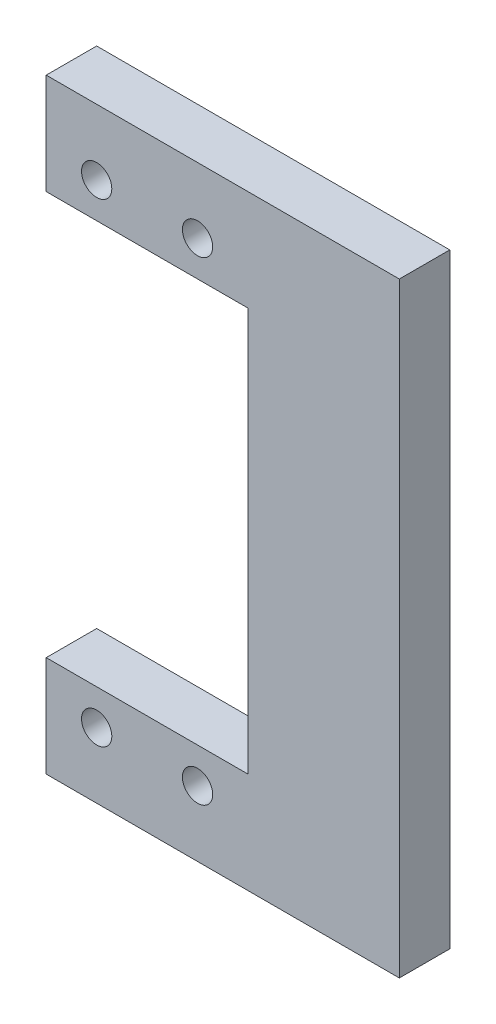
ISO-10303-21;
HEADER;
FILE_DESCRIPTION(('STEP AP214'),'2;1');
FILE_NAME('part.step','',(''),(''),'','','');
FILE_SCHEMA(('AUTOMOTIVE_DESIGN { 1 0 10303 214 1 1 1 1 }'));
ENDSEC;
DATA;
#1=APPLICATION_CONTEXT('core data for automotive mechanical design processes');
#2=APPLICATION_PROTOCOL_DEFINITION('international standard','automotive_design',2000,#1);
#3=PRODUCT_CONTEXT('',#1,'mechanical');
#4=PRODUCT('Part','Part','',(#3));
#5=PRODUCT_RELATED_PRODUCT_CATEGORY('part','',(#4));
#6=PRODUCT_DEFINITION_FORMATION('','',#4);
#7=PRODUCT_DEFINITION_CONTEXT('part definition',#1,'design');
#8=PRODUCT_DEFINITION('design','',#6,#7);
#9=PRODUCT_DEFINITION_SHAPE('','',#8);
#10=(LENGTH_UNIT() NAMED_UNIT(*) SI_UNIT(.MILLI.,.METRE.));
#11=(NAMED_UNIT(*) PLANE_ANGLE_UNIT() SI_UNIT($,.RADIAN.));
#12=(NAMED_UNIT(*) SI_UNIT($,.STERADIAN.) SOLID_ANGLE_UNIT());
#13=UNCERTAINTY_MEASURE_WITH_UNIT(LENGTH_MEASURE(1.E-05),#10,'distance_accuracy_value','');
#14=(GEOMETRIC_REPRESENTATION_CONTEXT(3) GLOBAL_UNCERTAINTY_ASSIGNED_CONTEXT((#13)) GLOBAL_UNIT_ASSIGNED_CONTEXT((#10,
#11,#12)) REPRESENTATION_CONTEXT('',''));
#15=CARTESIAN_POINT('',(0.,0.,0.));
#16=DIRECTION('',(0.,0.,1.));
#17=DIRECTION('',(1.,0.,0.));
#18=AXIS2_PLACEMENT_3D('',#15,#16,#17);
#19=CARTESIAN_POINT('',(0.,0.,5.));
#20=DIRECTION('',(0.,0.,-1.));
#21=DIRECTION('',(-1.,0.,0.));
#22=AXIS2_PLACEMENT_3D('',#19,#20,#21);
#23=PLANE('',#22);
#24=CARTESIAN_POINT('',(15.,6.5,5.));
#25=DIRECTION('',(0.,0.,1.));
#26=DIRECTION('',(1.,0.,0.));
#27=AXIS2_PLACEMENT_3D('',#24,#25,#26);
#28=CIRCLE('',#27,1.5);
#29=CARTESIAN_POINT('',(16.5,6.5,5.));
#30=VERTEX_POINT('',#29);
#31=EDGE_CURVE('E187',#30,#30,#28,.T.);
#32=ORIENTED_EDGE('',*,*,#31,.F.);
#33=EDGE_LOOP('',(#32));
#34=FACE_BOUND('',#33,.T.);
#35=CARTESIAN_POINT('',(5.,53.5,5.));
#36=DIRECTION('',(0.,0.,1.));
#37=DIRECTION('',(1.,0.,0.));
#38=AXIS2_PLACEMENT_3D('',#35,#36,#37);
#39=CIRCLE('',#38,1.5);
#40=CARTESIAN_POINT('',(6.5,53.5,5.));
#41=VERTEX_POINT('',#40);
#42=EDGE_CURVE('E133',#41,#41,#39,.T.);
#43=ORIENTED_EDGE('',*,*,#42,.F.);
#44=EDGE_LOOP('',(#43));
#45=FACE_BOUND('',#44,.T.);
#46=DIRECTION('',(0.,-1.,0.));
#47=VECTOR('',#46,1.);
#48=CARTESIAN_POINT('',(0.,0.,5.));
#49=LINE('',#48,#47);
#50=CARTESIAN_POINT('',(0.,10.,5.));
#51=VERTEX_POINT('',#50);
#52=CARTESIAN_POINT('',(0.,0.,5.));
#53=VERTEX_POINT('',#52);
#54=EDGE_CURVE('E144',#51,#53,#49,.T.);
#55=ORIENTED_EDGE('',*,*,#54,.T.);
#56=DIRECTION('',(1.,0.,0.));
#57=VECTOR('',#56,1.);
#58=CARTESIAN_POINT('',(0.,0.,5.));
#59=LINE('',#58,#57);
#60=CARTESIAN_POINT('',(35.,0.,5.));
#61=VERTEX_POINT('',#60);
#62=EDGE_CURVE('E92',#53,#61,#59,.T.);
#63=ORIENTED_EDGE('',*,*,#62,.T.);
#64=DIRECTION('',(0.,1.,0.));
#65=VECTOR('',#64,1.);
#66=CARTESIAN_POINT('',(35.,0.,5.));
#67=LINE('',#66,#65);
#68=CARTESIAN_POINT('',(35.,60.,5.));
#69=VERTEX_POINT('',#68);
#70=EDGE_CURVE('E159',#61,#69,#67,.T.);
#71=ORIENTED_EDGE('',*,*,#70,.T.);
#72=DIRECTION('',(-1.,0.,0.));
#73=VECTOR('',#72,1.);
#74=CARTESIAN_POINT('',(0.,60.,5.));
#75=LINE('',#74,#73);
#76=CARTESIAN_POINT('',(0.,60.,5.));
#77=VERTEX_POINT('',#76);
#78=EDGE_CURVE('E172',#69,#77,#75,.T.);
#79=ORIENTED_EDGE('',*,*,#78,.T.);
#80=DIRECTION('',(0.,-1.,0.));
#81=VECTOR('',#80,1.);
#82=CARTESIAN_POINT('',(0.,50.,5.));
#83=LINE('',#82,#81);
#84=CARTESIAN_POINT('',(0.,50.,5.));
#85=VERTEX_POINT('',#84);
#86=EDGE_CURVE('E111',#77,#85,#83,.T.);
#87=ORIENTED_EDGE('',*,*,#86,.T.);
#88=DIRECTION('',(1.,0.,0.));
#89=VECTOR('',#88,1.);
#90=CARTESIAN_POINT('',(0.,50.,5.));
#91=LINE('',#90,#89);
#92=CARTESIAN_POINT('',(20.,50.,5.));
#93=VERTEX_POINT('',#92);
#94=EDGE_CURVE('E105',#85,#93,#91,.T.);
#95=ORIENTED_EDGE('',*,*,#94,.T.);
#96=DIRECTION('',(0.,-1.,0.));
#97=VECTOR('',#96,1.);
#98=CARTESIAN_POINT('',(20.,10.,5.));
#99=LINE('',#98,#97);
#100=CARTESIAN_POINT('',(20.,10.,5.));
#101=VERTEX_POINT('',#100);
#102=EDGE_CURVE('E109',#93,#101,#99,.T.);
#103=ORIENTED_EDGE('',*,*,#102,.T.);
#104=DIRECTION('',(-1.,0.,0.));
#105=VECTOR('',#104,1.);
#106=CARTESIAN_POINT('',(0.,10.,5.));
#107=LINE('',#106,#105);
#108=EDGE_CURVE('E49',#101,#51,#107,.T.);
#109=ORIENTED_EDGE('',*,*,#108,.T.);
#110=EDGE_LOOP('',(#55,#63,#71,#79,#87,#95,#103,#109));
#111=FACE_BOUND('',#110,.T.);
#112=CARTESIAN_POINT('',(15.,53.5,5.));
#113=DIRECTION('',(0.,0.,1.));
#114=DIRECTION('',(-1.,0.,0.));
#115=AXIS2_PLACEMENT_3D('',#112,#113,#114);
#116=CIRCLE('',#115,1.5);
#117=CARTESIAN_POINT('',(13.5,53.5,5.));
#118=VERTEX_POINT('',#117);
#119=EDGE_CURVE('E181',#118,#118,#116,.T.);
#120=ORIENTED_EDGE('',*,*,#119,.F.);
#121=EDGE_LOOP('',(#120));
#122=FACE_BOUND('',#121,.T.);
#123=CARTESIAN_POINT('',(5.,6.5,5.));
#124=DIRECTION('',(0.,0.,1.));
#125=DIRECTION('',(-1.,0.,0.));
#126=AXIS2_PLACEMENT_3D('',#123,#124,#125);
#127=CIRCLE('',#126,1.5);
#128=CARTESIAN_POINT('',(3.5,6.5,5.));
#129=VERTEX_POINT('',#128);
#130=EDGE_CURVE('E193',#129,#129,#127,.T.);
#131=ORIENTED_EDGE('',*,*,#130,.F.);
#132=EDGE_LOOP('',(#131));
#133=FACE_BOUND('',#132,.T.);
#134=ADVANCED_FACE('F32',(#34,#45,#111,#122,#133),#23,.F.);
#135=CARTESIAN_POINT('',(0.,0.,0.));
#136=DIRECTION('',(0.,0.,-1.));
#137=DIRECTION('',(-1.,0.,0.));
#138=AXIS2_PLACEMENT_3D('',#135,#136,#137);
#139=PLANE('',#138);
#140=CARTESIAN_POINT('',(15.,6.5,0.));
#141=DIRECTION('',(0.,0.,1.));
#142=DIRECTION('',(1.,0.,0.));
#143=AXIS2_PLACEMENT_3D('',#140,#141,#142);
#144=CIRCLE('',#143,1.5);
#145=CARTESIAN_POINT('',(16.5,6.5,0.));
#146=VERTEX_POINT('',#145);
#147=EDGE_CURVE('E190',#146,#146,#144,.T.);
#148=ORIENTED_EDGE('',*,*,#147,.T.);
#149=EDGE_LOOP('',(#148));
#150=FACE_BOUND('',#149,.T.);
#151=CARTESIAN_POINT('',(5.,53.5,0.));
#152=DIRECTION('',(0.,0.,1.));
#153=DIRECTION('',(1.,0.,0.));
#154=AXIS2_PLACEMENT_3D('',#151,#152,#153);
#155=CIRCLE('',#154,1.5);
#156=CARTESIAN_POINT('',(6.5,53.5,0.));
#157=VERTEX_POINT('',#156);
#158=EDGE_CURVE('E178',#157,#157,#155,.T.);
#159=ORIENTED_EDGE('',*,*,#158,.T.);
#160=EDGE_LOOP('',(#159));
#161=FACE_BOUND('',#160,.T.);
#162=DIRECTION('',(0.,-1.,0.));
#163=VECTOR('',#162,1.);
#164=CARTESIAN_POINT('',(0.,0.,0.));
#165=LINE('',#164,#163);
#166=CARTESIAN_POINT('',(0.,10.,0.));
#167=VERTEX_POINT('',#166);
#168=CARTESIAN_POINT('',(0.,0.,0.));
#169=VERTEX_POINT('',#168);
#170=EDGE_CURVE('E129',#167,#169,#165,.T.);
#171=ORIENTED_EDGE('',*,*,#170,.F.);
#172=DIRECTION('',(-1.,0.,0.));
#173=VECTOR('',#172,1.);
#174=CARTESIAN_POINT('',(0.,10.,0.));
#175=LINE('',#174,#173);
#176=CARTESIAN_POINT('',(20.,10.,0.));
#177=VERTEX_POINT('',#176);
#178=EDGE_CURVE('E84',#177,#167,#175,.T.);
#179=ORIENTED_EDGE('',*,*,#178,.F.);
#180=DIRECTION('',(0.,-1.,0.));
#181=VECTOR('',#180,1.);
#182=CARTESIAN_POINT('',(20.,10.,0.));
#183=LINE('',#182,#181);
#184=CARTESIAN_POINT('',(20.,50.,0.));
#185=VERTEX_POINT('',#184);
#186=EDGE_CURVE('E78',#185,#177,#183,.T.);
#187=ORIENTED_EDGE('',*,*,#186,.F.);
#188=DIRECTION('',(1.,0.,0.));
#189=VECTOR('',#188,1.);
#190=CARTESIAN_POINT('',(0.,50.,0.));
#191=LINE('',#190,#189);
#192=CARTESIAN_POINT('',(0.,50.,0.));
#193=VERTEX_POINT('',#192);
#194=EDGE_CURVE('E119',#193,#185,#191,.T.);
#195=ORIENTED_EDGE('',*,*,#194,.F.);
#196=DIRECTION('',(0.,-1.,0.));
#197=VECTOR('',#196,1.);
#198=CARTESIAN_POINT('',(0.,50.,0.));
#199=LINE('',#198,#197);
#200=CARTESIAN_POINT('',(0.,60.,0.));
#201=VERTEX_POINT('',#200);
#202=EDGE_CURVE('E139',#201,#193,#199,.T.);
#203=ORIENTED_EDGE('',*,*,#202,.F.);
#204=DIRECTION('',(-1.,0.,0.));
#205=VECTOR('',#204,1.);
#206=CARTESIAN_POINT('',(0.,60.,0.));
#207=LINE('',#206,#205);
#208=CARTESIAN_POINT('',(35.,60.,0.));
#209=VERTEX_POINT('',#208);
#210=EDGE_CURVE('E137',#209,#201,#207,.T.);
#211=ORIENTED_EDGE('',*,*,#210,.F.);
#212=DIRECTION('',(0.,1.,0.));
#213=VECTOR('',#212,1.);
#214=CARTESIAN_POINT('',(35.,0.,0.));
#215=LINE('',#214,#213);
#216=CARTESIAN_POINT('',(35.,0.,0.));
#217=VERTEX_POINT('',#216);
#218=EDGE_CURVE('E135',#217,#209,#215,.T.);
#219=ORIENTED_EDGE('',*,*,#218,.F.);
#220=DIRECTION('',(1.,0.,0.));
#221=VECTOR('',#220,1.);
#222=CARTESIAN_POINT('',(0.,0.,0.));
#223=LINE('',#222,#221);
#224=EDGE_CURVE('E132',#169,#217,#223,.T.);
#225=ORIENTED_EDGE('',*,*,#224,.F.);
#226=EDGE_LOOP('',(#171,#179,#187,#195,#203,#211,#219,#225));
#227=FACE_BOUND('',#226,.T.);
#228=CARTESIAN_POINT('',(15.,53.5,0.));
#229=DIRECTION('',(0.,0.,1.));
#230=DIRECTION('',(-1.,0.,0.));
#231=AXIS2_PLACEMENT_3D('',#228,#229,#230);
#232=CIRCLE('',#231,1.5);
#233=CARTESIAN_POINT('',(13.5,53.5,0.));
#234=VERTEX_POINT('',#233);
#235=EDGE_CURVE('E184',#234,#234,#232,.T.);
#236=ORIENTED_EDGE('',*,*,#235,.T.);
#237=EDGE_LOOP('',(#236));
#238=FACE_BOUND('',#237,.T.);
#239=CARTESIAN_POINT('',(5.,6.5,0.));
#240=DIRECTION('',(0.,0.,1.));
#241=DIRECTION('',(-1.,0.,0.));
#242=AXIS2_PLACEMENT_3D('',#239,#240,#241);
#243=CIRCLE('',#242,1.5);
#244=CARTESIAN_POINT('',(3.5,6.5,0.));
#245=VERTEX_POINT('',#244);
#246=EDGE_CURVE('E196',#245,#245,#243,.T.);
#247=ORIENTED_EDGE('',*,*,#246,.T.);
#248=EDGE_LOOP('',(#247));
#249=FACE_BOUND('',#248,.T.);
#250=ADVANCED_FACE('F163',(#150,#161,#227,#238,#249),#139,.T.);
#251=CARTESIAN_POINT('',(0.,0.,5.));
#252=DIRECTION('',(1.,0.,0.));
#253=DIRECTION('',(0.,0.,-1.));
#254=AXIS2_PLACEMENT_3D('',#251,#252,#253);
#255=PLANE('',#254);
#256=ORIENTED_EDGE('',*,*,#170,.T.);
#257=DIRECTION('',(0.,0.,-1.));
#258=VECTOR('',#257,1.);
#259=CARTESIAN_POINT('',(0.,0.,5.));
#260=LINE('',#259,#258);
#261=EDGE_CURVE('E11',#53,#169,#260,.T.);
#262=ORIENTED_EDGE('',*,*,#261,.F.);
#263=ORIENTED_EDGE('',*,*,#54,.F.);
#264=DIRECTION('',(0.,0.,-1.));
#265=VECTOR('',#264,1.);
#266=CARTESIAN_POINT('',(0.,10.,5.));
#267=LINE('',#266,#265);
#268=EDGE_CURVE('E125',#51,#167,#267,.T.);
#269=ORIENTED_EDGE('',*,*,#268,.T.);
#270=EDGE_LOOP('',(#256,#262,#263,#269));
#271=FACE_BOUND('',#270,.T.);
#272=ADVANCED_FACE('F34',(#271),#255,.F.);
#273=CARTESIAN_POINT('',(0.,0.,5.));
#274=DIRECTION('',(0.,1.,0.));
#275=DIRECTION('',(0.,0.,1.));
#276=AXIS2_PLACEMENT_3D('',#273,#274,#275);
#277=PLANE('',#276);
#278=ORIENTED_EDGE('',*,*,#224,.T.);
#279=DIRECTION('',(0.,0.,-1.));
#280=VECTOR('',#279,1.);
#281=CARTESIAN_POINT('',(35.,0.,5.));
#282=LINE('',#281,#280);
#283=EDGE_CURVE('E41',#61,#217,#282,.T.);
#284=ORIENTED_EDGE('',*,*,#283,.F.);
#285=ORIENTED_EDGE('',*,*,#62,.F.);
#286=ORIENTED_EDGE('',*,*,#261,.T.);
#287=EDGE_LOOP('',(#278,#284,#285,#286));
#288=FACE_BOUND('',#287,.T.);
#289=ADVANCED_FACE('F231',(#288),#277,.F.);
#290=CARTESIAN_POINT('',(35.,0.,5.));
#291=DIRECTION('',(-1.,0.,0.));
#292=DIRECTION('',(0.,0.,1.));
#293=AXIS2_PLACEMENT_3D('',#290,#291,#292);
#294=PLANE('',#293);
#295=ORIENTED_EDGE('',*,*,#218,.T.);
#296=DIRECTION('',(0.,0.,-1.));
#297=VECTOR('',#296,1.);
#298=CARTESIAN_POINT('',(35.,60.,5.));
#299=LINE('',#298,#297);
#300=EDGE_CURVE('E151',#69,#209,#299,.T.);
#301=ORIENTED_EDGE('',*,*,#300,.F.);
#302=ORIENTED_EDGE('',*,*,#70,.F.);
#303=ORIENTED_EDGE('',*,*,#283,.T.);
#304=EDGE_LOOP('',(#295,#301,#302,#303));
#305=FACE_BOUND('',#304,.T.);
#306=ADVANCED_FACE('F157',(#305),#294,.F.);
#307=CARTESIAN_POINT('',(0.,60.,5.));
#308=DIRECTION('',(0.,-1.,0.));
#309=DIRECTION('',(0.,0.,-1.));
#310=AXIS2_PLACEMENT_3D('',#307,#308,#309);
#311=PLANE('',#310);
#312=ORIENTED_EDGE('',*,*,#210,.T.);
#313=DIRECTION('',(0.,0.,-1.));
#314=VECTOR('',#313,1.);
#315=CARTESIAN_POINT('',(0.,60.,5.));
#316=LINE('',#315,#314);
#317=EDGE_CURVE('E148',#77,#201,#316,.T.);
#318=ORIENTED_EDGE('',*,*,#317,.F.);
#319=ORIENTED_EDGE('',*,*,#78,.F.);
#320=ORIENTED_EDGE('',*,*,#300,.T.);
#321=EDGE_LOOP('',(#312,#318,#319,#320));
#322=FACE_BOUND('',#321,.T.);
#323=ADVANCED_FACE('F168',(#322),#311,.F.);
#324=CARTESIAN_POINT('',(0.,50.,5.));
#325=DIRECTION('',(1.,0.,0.));
#326=DIRECTION('',(0.,0.,-1.));
#327=AXIS2_PLACEMENT_3D('',#324,#325,#326);
#328=PLANE('',#327);
#329=ORIENTED_EDGE('',*,*,#202,.T.);
#330=DIRECTION('',(0.,0.,-1.));
#331=VECTOR('',#330,1.);
#332=CARTESIAN_POINT('',(0.,50.,5.));
#333=LINE('',#332,#331);
#334=EDGE_CURVE('E120',#85,#193,#333,.T.);
#335=ORIENTED_EDGE('',*,*,#334,.F.);
#336=ORIENTED_EDGE('',*,*,#86,.F.);
#337=ORIENTED_EDGE('',*,*,#317,.T.);
#338=EDGE_LOOP('',(#329,#335,#336,#337));
#339=FACE_BOUND('',#338,.T.);
#340=ADVANCED_FACE('F171',(#339),#328,.F.);
#341=CARTESIAN_POINT('',(0.,50.,5.));
#342=DIRECTION('',(0.,1.,0.));
#343=DIRECTION('',(0.,0.,1.));
#344=AXIS2_PLACEMENT_3D('',#341,#342,#343);
#345=PLANE('',#344);
#346=ORIENTED_EDGE('',*,*,#194,.T.);
#347=DIRECTION('',(0.,0.,-1.));
#348=VECTOR('',#347,1.);
#349=CARTESIAN_POINT('',(20.,50.,5.));
#350=LINE('',#349,#348);
#351=EDGE_CURVE('E116',#93,#185,#350,.T.);
#352=ORIENTED_EDGE('',*,*,#351,.F.);
#353=ORIENTED_EDGE('',*,*,#94,.F.);
#354=ORIENTED_EDGE('',*,*,#334,.T.);
#355=EDGE_LOOP('',(#346,#352,#353,#354));
#356=FACE_BOUND('',#355,.T.);
#357=ADVANCED_FACE('F117',(#356),#345,.F.);
#358=CARTESIAN_POINT('',(20.,10.,5.));
#359=DIRECTION('',(1.,0.,0.));
#360=DIRECTION('',(0.,0.,-1.));
#361=AXIS2_PLACEMENT_3D('',#358,#359,#360);
#362=PLANE('',#361);
#363=ORIENTED_EDGE('',*,*,#186,.T.);
#364=DIRECTION('',(0.,0.,-1.));
#365=VECTOR('',#364,1.);
#366=CARTESIAN_POINT('',(20.,10.,5.));
#367=LINE('',#366,#365);
#368=EDGE_CURVE('E121',#101,#177,#367,.T.);
#369=ORIENTED_EDGE('',*,*,#368,.F.);
#370=ORIENTED_EDGE('',*,*,#102,.F.);
#371=ORIENTED_EDGE('',*,*,#351,.T.);
#372=EDGE_LOOP('',(#363,#369,#370,#371));
#373=FACE_BOUND('',#372,.T.);
#374=ADVANCED_FACE('F123',(#373),#362,.F.);
#375=CARTESIAN_POINT('',(0.,10.,5.));
#376=DIRECTION('',(0.,-1.,0.));
#377=DIRECTION('',(0.,0.,-1.));
#378=AXIS2_PLACEMENT_3D('',#375,#376,#377);
#379=PLANE('',#378);
#380=ORIENTED_EDGE('',*,*,#178,.T.);
#381=ORIENTED_EDGE('',*,*,#268,.F.);
#382=ORIENTED_EDGE('',*,*,#108,.F.);
#383=ORIENTED_EDGE('',*,*,#368,.T.);
#384=EDGE_LOOP('',(#380,#381,#382,#383));
#385=FACE_BOUND('',#384,.T.);
#386=ADVANCED_FACE('F219',(#385),#379,.F.);
#387=CARTESIAN_POINT('',(5.,53.5,5.));
#388=DIRECTION('',(0.,0.,-1.));
#389=DIRECTION('',(-1.,0.,0.));
#390=AXIS2_PLACEMENT_3D('',#387,#388,#389);
#391=CYLINDRICAL_SURFACE('',#390,1.5);
#392=ORIENTED_EDGE('',*,*,#42,.T.);
#393=EDGE_LOOP('',(#392));
#394=FACE_BOUND('',#393,.T.);
#395=ORIENTED_EDGE('',*,*,#158,.F.);
#396=EDGE_LOOP('',(#395));
#397=FACE_BOUND('',#396,.T.);
#398=ADVANCED_FACE('F216',(#394,#397),#391,.F.);
#399=CARTESIAN_POINT('',(15.,53.5,5.));
#400=DIRECTION('',(0.,0.,-1.));
#401=DIRECTION('',(-1.,0.,0.));
#402=AXIS2_PLACEMENT_3D('',#399,#400,#401);
#403=CYLINDRICAL_SURFACE('',#402,1.5);
#404=ORIENTED_EDGE('',*,*,#119,.T.);
#405=EDGE_LOOP('',(#404));
#406=FACE_BOUND('',#405,.T.);
#407=ORIENTED_EDGE('',*,*,#235,.F.);
#408=EDGE_LOOP('',(#407));
#409=FACE_BOUND('',#408,.T.);
#410=ADVANCED_FACE('F295',(#406,#409),#403,.F.);
#411=CARTESIAN_POINT('',(15.,6.5,5.));
#412=DIRECTION('',(0.,0.,-1.));
#413=DIRECTION('',(-1.,0.,0.));
#414=AXIS2_PLACEMENT_3D('',#411,#412,#413);
#415=CYLINDRICAL_SURFACE('',#414,1.5);
#416=ORIENTED_EDGE('',*,*,#31,.T.);
#417=EDGE_LOOP('',(#416));
#418=FACE_BOUND('',#417,.T.);
#419=ORIENTED_EDGE('',*,*,#147,.F.);
#420=EDGE_LOOP('',(#419));
#421=FACE_BOUND('',#420,.T.);
#422=ADVANCED_FACE('F303',(#418,#421),#415,.F.);
#423=CARTESIAN_POINT('',(5.,6.5,5.));
#424=DIRECTION('',(0.,0.,-1.));
#425=DIRECTION('',(-1.,0.,0.));
#426=AXIS2_PLACEMENT_3D('',#423,#424,#425);
#427=CYLINDRICAL_SURFACE('',#426,1.5);
#428=ORIENTED_EDGE('',*,*,#130,.T.);
#429=EDGE_LOOP('',(#428));
#430=FACE_BOUND('',#429,.T.);
#431=ORIENTED_EDGE('',*,*,#246,.F.);
#432=EDGE_LOOP('',(#431));
#433=FACE_BOUND('',#432,.T.);
#434=ADVANCED_FACE('F202',(#430,#433),#427,.F.);
#435=CLOSED_SHELL('',(#134,#250,#272,#289,#306,#323,#340,#357,#374,#386,#398,#410,#422,#434));
#436=MANIFOLD_SOLID_BREP('B2',#435);
#437=ADVANCED_BREP_SHAPE_REPRESENTATION('',(#18,#436),#14);
#438=SHAPE_DEFINITION_REPRESENTATION(#9,#437);
ENDSEC;
END-ISO-10303-21;
